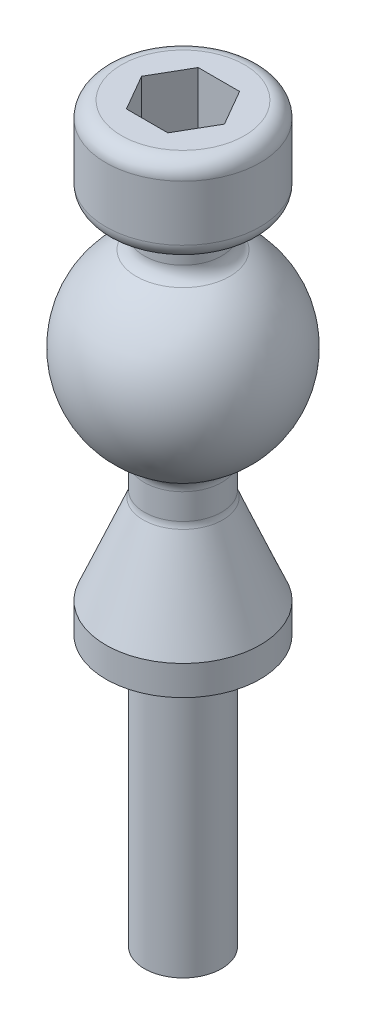
ISO-10303-21;
HEADER;
FILE_DESCRIPTION(('STEP AP214'),'2;1');
FILE_NAME('part.step','',(''),(''),'','','');
FILE_SCHEMA(('AUTOMOTIVE_DESIGN { 1 0 10303 214 1 1 1 1 }'));
ENDSEC;
DATA;
#1=APPLICATION_CONTEXT('core data for automotive mechanical design processes');
#2=APPLICATION_PROTOCOL_DEFINITION('international standard','automotive_design',2000,#1);
#3=PRODUCT_CONTEXT('',#1,'mechanical');
#4=PRODUCT('Part','Part','',(#3));
#5=PRODUCT_RELATED_PRODUCT_CATEGORY('part','',(#4));
#6=PRODUCT_DEFINITION_FORMATION('','',#4);
#7=PRODUCT_DEFINITION_CONTEXT('part definition',#1,'design');
#8=PRODUCT_DEFINITION('design','',#6,#7);
#9=PRODUCT_DEFINITION_SHAPE('','',#8);
#10=(LENGTH_UNIT() NAMED_UNIT(*) SI_UNIT(.MILLI.,.METRE.));
#11=(NAMED_UNIT(*) PLANE_ANGLE_UNIT() SI_UNIT($,.RADIAN.));
#12=(NAMED_UNIT(*) SI_UNIT($,.STERADIAN.) SOLID_ANGLE_UNIT());
#13=UNCERTAINTY_MEASURE_WITH_UNIT(LENGTH_MEASURE(1.E-05),#10,'distance_accuracy_value','');
#14=(GEOMETRIC_REPRESENTATION_CONTEXT(3) GLOBAL_UNCERTAINTY_ASSIGNED_CONTEXT((#13)) GLOBAL_UNIT_ASSIGNED_CONTEXT((#10,
#11,#12)) REPRESENTATION_CONTEXT('',''));
#15=CARTESIAN_POINT('',(0.,0.,0.));
#16=DIRECTION('',(0.,0.,1.));
#17=DIRECTION('',(1.,0.,0.));
#18=AXIS2_PLACEMENT_3D('',#15,#16,#17);
#19=CARTESIAN_POINT('',(0.,15.24,0.));
#20=DIRECTION('',(0.,-1.,0.));
#21=DIRECTION('',(1.,0.,0.));
#22=AXIS2_PLACEMENT_3D('',#19,#20,#21);
#23=PLANE('',#22);
#24=DIRECTION('',(0.5,0.,0.866025403784438));
#25=VECTOR('',#24,1.);
#26=CARTESIAN_POINT('',(-1.36381680587974,15.24,0.));
#27=LINE('',#26,#25);
#28=CARTESIAN_POINT('',(-1.36381680587974,15.24,0.));
#29=VERTEX_POINT('',#28);
#30=CARTESIAN_POINT('',(-0.681908402939869,15.24,1.1811));
#31=VERTEX_POINT('',#30);
#32=EDGE_CURVE('E121',#29,#31,#27,.T.);
#33=ORIENTED_EDGE('',*,*,#32,.F.);
#34=DIRECTION('',(-0.5,0.,0.866025403784439));
#35=VECTOR('',#34,1.);
#36=CARTESIAN_POINT('',(-0.681908402939869,15.24,-1.1811));
#37=LINE('',#36,#35);
#38=CARTESIAN_POINT('',(-0.681908402939869,15.24,-1.1811));
#39=VERTEX_POINT('',#38);
#40=EDGE_CURVE('E47',#39,#29,#37,.T.);
#41=ORIENTED_EDGE('',*,*,#40,.F.);
#42=DIRECTION('',(-1.,0.,0.));
#43=VECTOR('',#42,1.);
#44=CARTESIAN_POINT('',(0.681908402939864,15.24,-1.1811));
#45=LINE('',#44,#43);
#46=CARTESIAN_POINT('',(0.681908402939864,15.24,-1.1811));
#47=VERTEX_POINT('',#46);
#48=EDGE_CURVE('E130',#47,#39,#45,.T.);
#49=ORIENTED_EDGE('',*,*,#48,.F.);
#50=DIRECTION('',(-0.5,0.,-0.866025403784439));
#51=VECTOR('',#50,1.);
#52=CARTESIAN_POINT('',(1.36381680587973,15.24,0.));
#53=LINE('',#52,#51);
#54=CARTESIAN_POINT('',(1.36381680587973,15.24,0.));
#55=VERTEX_POINT('',#54);
#56=EDGE_CURVE('E128',#55,#47,#53,.T.);
#57=ORIENTED_EDGE('',*,*,#56,.F.);
#58=DIRECTION('',(0.5,0.,-0.866025403784439));
#59=VECTOR('',#58,1.);
#60=CARTESIAN_POINT('',(0.681908402939865,15.24,1.1811));
#61=LINE('',#60,#59);
#62=CARTESIAN_POINT('',(0.681908402939865,15.24,1.1811));
#63=VERTEX_POINT('',#62);
#64=EDGE_CURVE('E95',#63,#55,#61,.T.);
#65=ORIENTED_EDGE('',*,*,#64,.F.);
#66=DIRECTION('',(1.,0.,0.));
#67=VECTOR('',#66,1.);
#68=CARTESIAN_POINT('',(-0.681908402939869,15.24,1.1811));
#69=LINE('',#68,#67);
#70=EDGE_CURVE('E124',#31,#63,#69,.T.);
#71=ORIENTED_EDGE('',*,*,#70,.F.);
#72=EDGE_LOOP('',(#33,#41,#49,#57,#65,#71));
#73=FACE_BOUND('',#72,.T.);
#74=CARTESIAN_POINT('',(0.,15.24,0.));
#75=DIRECTION('',(0.,1.,0.));
#76=DIRECTION('',(-1.,0.,0.));
#77=AXIS2_PLACEMENT_3D('',#74,#75,#76);
#78=CIRCLE('',#77,2.02450269481178);
#79=CARTESIAN_POINT('',(-2.02450269481178,15.24,0.));
#80=VERTEX_POINT('',#79);
#81=EDGE_CURVE('E11',#80,#80,#78,.T.);
#82=ORIENTED_EDGE('',*,*,#81,.T.);
#83=EDGE_LOOP('',(#82));
#84=FACE_BOUND('',#83,.T.);
#85=ADVANCED_FACE('F33',(#73,#84),#23,.F.);
#86=CARTESIAN_POINT('',(0.,14.7245026948118,0.));
#87=DIRECTION('',(0.,1.,0.));
#88=DIRECTION('',(-1.,0.,0.));
#89=AXIS2_PLACEMENT_3D('',#86,#87,#88);
#90=TOROIDAL_SURFACE('',#89,2.02450269481178,0.515497305188219);
#91=ORIENTED_EDGE('',*,*,#81,.F.);
#92=EDGE_LOOP('',(#91));
#93=FACE_BOUND('',#92,.T.);
#94=CARTESIAN_POINT('',(0.,14.7245026948118,0.));
#95=DIRECTION('',(0.,1.,0.));
#96=DIRECTION('',(-1.,0.,0.));
#97=AXIS2_PLACEMENT_3D('',#94,#95,#96);
#98=CIRCLE('',#97,2.54);
#99=CARTESIAN_POINT('',(-2.54,14.7245026948118,0.));
#100=VERTEX_POINT('',#99);
#101=EDGE_CURVE('E40',#100,#100,#98,.T.);
#102=ORIENTED_EDGE('',*,*,#101,.T.);
#103=EDGE_LOOP('',(#102));
#104=FACE_BOUND('',#103,.T.);
#105=ADVANCED_FACE('F183',(#93,#104),#90,.T.);
#106=CARTESIAN_POINT('',(0.,15.24,0.));
#107=DIRECTION('',(0.,1.,0.));
#108=DIRECTION('',(-1.,0.,0.));
#109=AXIS2_PLACEMENT_3D('',#106,#107,#108);
#110=CYLINDRICAL_SURFACE('',#109,2.54);
#111=ORIENTED_EDGE('',*,*,#101,.F.);
#112=EDGE_LOOP('',(#111));
#113=FACE_BOUND('',#112,.T.);
#114=CARTESIAN_POINT('',(0.,12.8979973051882,0.));
#115=DIRECTION('',(0.,1.,0.));
#116=DIRECTION('',(-1.,0.,0.));
#117=AXIS2_PLACEMENT_3D('',#114,#115,#116);
#118=CIRCLE('',#117,2.54);
#119=CARTESIAN_POINT('',(-2.54,12.8979973051882,0.));
#120=VERTEX_POINT('',#119);
#121=EDGE_CURVE('E178',#120,#120,#118,.T.);
#122=ORIENTED_EDGE('',*,*,#121,.T.);
#123=EDGE_LOOP('',(#122));
#124=FACE_BOUND('',#123,.T.);
#125=ADVANCED_FACE('F185',(#113,#124),#110,.T.);
#126=CARTESIAN_POINT('',(0.,12.8979973051882,0.));
#127=DIRECTION('',(0.,1.,0.));
#128=DIRECTION('',(-1.,0.,0.));
#129=AXIS2_PLACEMENT_3D('',#126,#127,#128);
#130=TOROIDAL_SURFACE('',#129,2.02450269481178,0.515497305188219);
#131=ORIENTED_EDGE('',*,*,#121,.F.);
#132=EDGE_LOOP('',(#131));
#133=FACE_BOUND('',#132,.T.);
#134=CARTESIAN_POINT('',(0.,12.3825,0.));
#135=DIRECTION('',(0.,1.,0.));
#136=DIRECTION('',(-1.,0.,0.));
#137=AXIS2_PLACEMENT_3D('',#134,#135,#136);
#138=CIRCLE('',#137,2.02450269481178);
#139=CARTESIAN_POINT('',(-2.02450269481178,12.3825,0.));
#140=VERTEX_POINT('',#139);
#141=EDGE_CURVE('E175',#140,#140,#138,.T.);
#142=ORIENTED_EDGE('',*,*,#141,.T.);
#143=EDGE_LOOP('',(#142));
#144=FACE_BOUND('',#143,.T.);
#145=ADVANCED_FACE('F188',(#133,#144),#130,.T.);
#146=CARTESIAN_POINT('',(2.02450269481178,12.3825,0.));
#147=DIRECTION('',(0.,1.,0.));
#148=DIRECTION('',(-1.,0.,0.));
#149=AXIS2_PLACEMENT_3D('',#146,#147,#148);
#150=PLANE('',#149);
#151=ORIENTED_EDGE('',*,*,#141,.F.);
#152=EDGE_LOOP('',(#151));
#153=FACE_BOUND('',#152,.T.);
#154=CARTESIAN_POINT('',(0.,12.3825,0.));
#155=DIRECTION('',(0.,1.,0.));
#156=DIRECTION('',(-1.,0.,0.));
#157=AXIS2_PLACEMENT_3D('',#154,#155,#156);
#158=CIRCLE('',#157,1.78549730518822);
#159=CARTESIAN_POINT('',(-1.78549730518822,12.3825,0.));
#160=VERTEX_POINT('',#159);
#161=EDGE_CURVE('E172',#160,#160,#158,.T.);
#162=ORIENTED_EDGE('',*,*,#161,.T.);
#163=EDGE_LOOP('',(#162));
#164=FACE_BOUND('',#163,.T.);
#165=ADVANCED_FACE('F194',(#153,#164),#150,.F.);
#166=CARTESIAN_POINT('',(0.,11.8670026948118,0.));
#167=DIRECTION('',(0.,1.,0.));
#168=DIRECTION('',(-1.,0.,0.));
#169=AXIS2_PLACEMENT_3D('',#166,#167,#168);
#170=TOROIDAL_SURFACE('',#169,1.78549730518822,0.515497305188219);
#171=ORIENTED_EDGE('',*,*,#161,.F.);
#172=EDGE_LOOP('',(#171));
#173=FACE_BOUND('',#172,.T.);
#174=CARTESIAN_POINT('',(0.,11.8670026948118,0.));
#175=DIRECTION('',(0.,1.,0.));
#176=DIRECTION('',(-1.,0.,0.));
#177=AXIS2_PLACEMENT_3D('',#174,#175,#176);
#178=CIRCLE('',#177,1.27);
#179=CARTESIAN_POINT('',(-1.27,11.8670026948118,0.));
#180=VERTEX_POINT('',#179);
#181=EDGE_CURVE('E169',#180,#180,#178,.T.);
#182=ORIENTED_EDGE('',*,*,#181,.T.);
#183=EDGE_LOOP('',(#182));
#184=FACE_BOUND('',#183,.T.);
#185=ADVANCED_FACE('F200',(#173,#184),#170,.F.);
#186=CARTESIAN_POINT('',(0.,15.24,0.));
#187=DIRECTION('',(0.,1.,0.));
#188=DIRECTION('',(-1.,0.,0.));
#189=AXIS2_PLACEMENT_3D('',#186,#187,#188);
#190=CYLINDRICAL_SURFACE('',#189,1.27);
#191=ORIENTED_EDGE('',*,*,#181,.F.);
#192=EDGE_LOOP('',(#191));
#193=FACE_BOUND('',#192,.T.);
#194=CARTESIAN_POINT('',(0.,11.4323894649961,0.));
#195=DIRECTION('',(0.,1.,0.));
#196=DIRECTION('',(-1.,0.,0.));
#197=AXIS2_PLACEMENT_3D('',#194,#195,#196);
#198=CIRCLE('',#197,1.27);
#199=CARTESIAN_POINT('',(-1.27,11.4323894649961,0.));
#200=VERTEX_POINT('',#199);
#201=EDGE_CURVE('E166',#200,#200,#198,.T.);
#202=ORIENTED_EDGE('',*,*,#201,.T.);
#203=EDGE_LOOP('',(#202));
#204=FACE_BOUND('',#203,.T.);
#205=ADVANCED_FACE('F206',(#193,#204),#190,.T.);
#206=CARTESIAN_POINT('',(0.,11.4323894649961,0.));
#207=DIRECTION('',(0.,1.,0.));
#208=DIRECTION('',(-1.,0.,0.));
#209=AXIS2_PLACEMENT_3D('',#206,#207,#208);
#210=TOROIDAL_SURFACE('',#209,1.78549730518822,0.515497305188219);
#211=ORIENTED_EDGE('',*,*,#201,.F.);
#212=EDGE_LOOP('',(#211));
#213=FACE_BOUND('',#212,.T.);
#214=CARTESIAN_POINT('',(0.,10.9812399417271,0.));
#215=DIRECTION('',(0.,1.,0.));
#216=DIRECTION('',(-1.,0.,0.));
#217=AXIS2_PLACEMENT_3D('',#214,#215,#216);
#218=CIRCLE('',#217,1.5360948607124);
#219=CARTESIAN_POINT('',(1.5360948607124,10.9812399417271,0.));
#220=VERTEX_POINT('',#219);
#221=EDGE_CURVE('E163',#220,#220,#218,.T.);
#222=ORIENTED_EDGE('',*,*,#221,.T.);
#223=EDGE_LOOP('',(#222));
#224=FACE_BOUND('',#223,.T.);
#225=ADVANCED_FACE('F212',(#213,#224),#210,.F.);
#226=CARTESIAN_POINT('',(0.,8.20256443370304,0.));
#227=DIRECTION('',(0.,1.,0.));
#228=DIRECTION('',(1.,0.,0.));
#229=AXIS2_PLACEMENT_3D('',#226,#227,#228);
#230=SPHERICAL_SURFACE('',#229,3.175);
#231=CARTESIAN_POINT('',(0.,5.42388892567895,0.));
#232=DIRECTION('',(0.,1.,0.));
#233=DIRECTION('',(-1.,0.,0.));
#234=AXIS2_PLACEMENT_3D('',#231,#232,#233);
#235=CIRCLE('',#234,1.5360948607124);
#236=CARTESIAN_POINT('',(1.53609486071241,5.42388892567895,0.));
#237=VERTEX_POINT('',#236);
#238=EDGE_CURVE('E160',#237,#237,#235,.T.);
#239=CARTESIAN_POINT('',(1.5360948607124,10.9812399417271,0.));
#240=CARTESIAN_POINT('',(1.59779470955868,10.9471355752234,0.));
#241=CARTESIAN_POINT('',(1.65835464528086,10.910970086578,0.));
#242=CARTESIAN_POINT('',(1.77693495861089,10.8346910892589,0.));
#243=CARTESIAN_POINT('',(1.83495533621874,10.7945775805853,0.));
#244=CARTESIAN_POINT('',(1.94819680145398,10.7105767674652,0.));
#245=CARTESIAN_POINT('',(2.00341788908138,10.6666894630188,0.));
#246=CARTESIAN_POINT('',(2.1108164770995,10.5753367136276,0.));
#247=CARTESIAN_POINT('',(2.16299397749022,10.5278712686829,0.));
#248=CARTESIAN_POINT('',(2.2640737849774,10.4295725072636,0.));
#249=CARTESIAN_POINT('',(2.31297609207386,10.3787391907891,0.));
#250=CARTESIAN_POINT('',(2.40728865085206,10.2739302304776,0.));
#251=CARTESIAN_POINT('',(2.4526989025338,10.2199545866408,0.));
#252=CARTESIAN_POINT('',(2.53982591943265,10.1091003634086,0.));
#253=CARTESIAN_POINT('',(2.58154268464975,10.0522217840132,0.));
#254=CARTESIAN_POINT('',(2.66109769571783,9.93581398172825,0.));
#255=CARTESIAN_POINT('',(2.69893594156881,9.8762847588387,0.));
#256=CARTESIAN_POINT('',(2.77056608014429,9.75483971217198,0.));
#257=CARTESIAN_POINT('',(2.8043579728688,9.69292388839482,0.));
#258=CARTESIAN_POINT('',(2.86774552029059,9.56698027014875,0.));
#259=CARTESIAN_POINT('',(2.89734117498788,9.50295247567983,0.));
#260=CARTESIAN_POINT('',(2.95220497371757,9.37306891350159,0.));
#261=CARTESIAN_POINT('',(2.97747311774996,9.30721314579227,0.));
#262=CARTESIAN_POINT('',(3.02356981741918,9.17396574274927,0.));
#263=CARTESIAN_POINT('',(3.044398373056,9.10657410741559,0.));
#264=CARTESIAN_POINT('',(3.08152351013343,8.97055388710177,0.));
#265=CARTESIAN_POINT('',(3.09782009157404,8.90192530212163,0.));
#266=CARTESIAN_POINT('',(3.1258089961962,8.76373558703567,0.));
#267=CARTESIAN_POINT('',(3.13750131937775,8.69417445692986,0.));
#268=CARTESIAN_POINT('',(3.15622984576796,8.55442819244788,0.));
#269=CARTESIAN_POINT('',(3.16326604897662,8.48424305807172,0.));
#270=CARTESIAN_POINT('',(3.17265112609264,8.34356009369805,0.));
#271=CARTESIAN_POINT('',(3.175,8.27306226370055,0.));
#272=CARTESIAN_POINT('',(3.175,8.13206660370554,0.));
#273=CARTESIAN_POINT('',(3.17265112609264,8.06156877370803,0.));
#274=CARTESIAN_POINT('',(3.16326604897662,7.92088580933436,0.));
#275=CARTESIAN_POINT('',(3.15622984576796,7.8507006749582,0.));
#276=CARTESIAN_POINT('',(3.13750131937775,7.71095441047623,0.));
#277=CARTESIAN_POINT('',(3.1258089961962,7.64139328037041,0.));
#278=CARTESIAN_POINT('',(3.09782009157404,7.50320356528445,0.));
#279=CARTESIAN_POINT('',(3.08152351013343,7.43457498030431,0.));
#280=CARTESIAN_POINT('',(3.044398373056,7.29855475999049,0.));
#281=CARTESIAN_POINT('',(3.02356981741918,7.23116312465682,0.));
#282=CARTESIAN_POINT('',(2.97747311774996,7.09791572161382,0.));
#283=CARTESIAN_POINT('',(2.95220497371757,7.03205995390449,0.));
#284=CARTESIAN_POINT('',(2.89734117498788,6.90217639172625,0.));
#285=CARTESIAN_POINT('',(2.86774552029059,6.83814859725734,0.));
#286=CARTESIAN_POINT('',(2.8043579728688,6.71220497901126,0.));
#287=CARTESIAN_POINT('',(2.7705660801443,6.6502891552341,0.));
#288=CARTESIAN_POINT('',(2.69893594156881,6.52884410856738,0.));
#289=CARTESIAN_POINT('',(2.66109769571783,6.46931488567783,0.));
#290=CARTESIAN_POINT('',(2.58154268464975,6.35290708339287,0.));
#291=CARTESIAN_POINT('',(2.53982591943265,6.29602850399747,0.));
#292=CARTESIAN_POINT('',(2.4526989025338,6.18517428076525,0.));
#293=CARTESIAN_POINT('',(2.40728865085206,6.13119863692843,0.));
#294=CARTESIAN_POINT('',(2.31297609207386,6.02638967661703,0.));
#295=CARTESIAN_POINT('',(2.2640737849774,5.97555636014245,0.));
#296=CARTESIAN_POINT('',(2.16299397749022,5.87725759872316,0.));
#297=CARTESIAN_POINT('',(2.1108164770995,5.82979215377845,0.));
#298=CARTESIAN_POINT('',(2.00341788908138,5.73843940438731,0.));
#299=CARTESIAN_POINT('',(1.94819680145399,5.69455209994087,0.));
#300=CARTESIAN_POINT('',(1.83495533621874,5.6105512868208,0.));
#301=CARTESIAN_POINT('',(1.77693495861089,5.57043777814718,0.));
#302=CARTESIAN_POINT('',(1.65835464528087,5.4941587808281,0.));
#303=CARTESIAN_POINT('',(1.59779470955869,5.45799329218265,0.));
#304=CARTESIAN_POINT('',(1.53609486071241,5.42388892567895,0.));
#305=B_SPLINE_CURVE_WITH_KNOTS('',3,(#239,#240,#241,#242,#243,#244,#245,#246,#247,#248,#249,
#250,#251,#252,#253,#254,#255,#256,#257,#258,#259,#260,#261,#262,#263,#264,#265,#266,#267,#268,
#269,#270,#271,#272,#273,#274,#275,#276,#277,#278,#279,#280,#281,#282,#283,#284,#285,#286,#287,
#288,#289,#290,#291,#292,#293,#294,#295,#296,#297,#298,#299,#300,#301,#302,#303,#304),
.UNSPECIFIED.,.F.,.F.,(4,2,2,2,2,2,2,2,2,2,2,2,2,2,2,2,2,2,2,2,2,2,2,2,2,2,2,2,2,2,2,2,4),(0.,
0.211454413893626,0.42290882778725,0.634363241680874,0.8458176555745,1.05727206946813,
1.26872648336175,1.48018089725537,1.691635311149,1.90308972504262,2.11454413893625,
2.32599855282987,2.5374529667235,2.74890738061712,2.96036179451075,3.17181620840437,
3.383270622298,3.59472503619162,3.80617945008525,4.01763386397887,4.2290882778725,
4.44054269176612,4.65199710565975,4.86345151955337,5.074905933447,5.28636034734062,
5.49781476123425,5.70926917512787,5.9207235890215,6.13217800291512,6.34363241680875,
6.55508683070237,6.766541244596),.UNSPECIFIED.);
#306=EDGE_CURVE('BSEAM218',#220,#237,#305,.T.);
#307=ORIENTED_EDGE('',*,*,#221,.F.);
#308=ORIENTED_EDGE('',*,*,#238,.T.);
#309=ORIENTED_EDGE('',*,*,#306,.T.);
#310=ORIENTED_EDGE('',*,*,#306,.F.);
#311=EDGE_LOOP('',(#307,#309,#308,#310));
#312=FACE_BOUND('',#311,.T.);
#313=ADVANCED_FACE('F218',(#312),#230,.T.);
#314=CARTESIAN_POINT('',(0.,4.97273940241,0.));
#315=DIRECTION('',(0.,1.,0.));
#316=DIRECTION('',(-1.,0.,0.));
#317=AXIS2_PLACEMENT_3D('',#314,#315,#316);
#318=TOROIDAL_SURFACE('',#317,1.78549730518822,0.515497305188219);
#319=ORIENTED_EDGE('',*,*,#238,.F.);
#320=EDGE_LOOP('',(#319));
#321=FACE_BOUND('',#320,.T.);
#322=CARTESIAN_POINT('',(0.,4.97273940241,0.));
#323=DIRECTION('',(0.,1.,0.));
#324=DIRECTION('',(-1.,0.,0.));
#325=AXIS2_PLACEMENT_3D('',#322,#323,#324);
#326=CIRCLE('',#325,1.27);
#327=CARTESIAN_POINT('',(-1.27,4.97273940241,0.));
#328=VERTEX_POINT('',#327);
#329=EDGE_CURVE('E157',#328,#328,#326,.T.);
#330=ORIENTED_EDGE('',*,*,#329,.T.);
#331=EDGE_LOOP('',(#330));
#332=FACE_BOUND('',#331,.T.);
#333=ADVANCED_FACE('F224',(#321,#332),#318,.F.);
#334=CARTESIAN_POINT('',(0.,15.24,0.));
#335=DIRECTION('',(0.,1.,0.));
#336=DIRECTION('',(-1.,0.,0.));
#337=AXIS2_PLACEMENT_3D('',#334,#335,#336);
#338=CYLINDRICAL_SURFACE('',#337,1.27);
#339=ORIENTED_EDGE('',*,*,#329,.F.);
#340=EDGE_LOOP('',(#339));
#341=FACE_BOUND('',#340,.T.);
#342=CARTESIAN_POINT('',(0.,4.12572832844373,0.));
#343=DIRECTION('',(0.,1.,0.));
#344=DIRECTION('',(-1.,0.,0.));
#345=AXIS2_PLACEMENT_3D('',#342,#343,#344);
#346=CIRCLE('',#345,1.27);
#347=CARTESIAN_POINT('',(-1.27,4.12572832844373,0.));
#348=VERTEX_POINT('',#347);
#349=EDGE_CURVE('E154',#348,#348,#346,.T.);
#350=ORIENTED_EDGE('',*,*,#349,.T.);
#351=EDGE_LOOP('',(#350));
#352=FACE_BOUND('',#351,.T.);
#353=ADVANCED_FACE('F230',(#341,#352),#338,.T.);
#354=CARTESIAN_POINT('',(0.,4.12572832844373,0.));
#355=DIRECTION('',(0.,1.,0.));
#356=DIRECTION('',(-1.,0.,0.));
#357=AXIS2_PLACEMENT_3D('',#354,#355,#356);
#358=TOROIDAL_SURFACE('',#357,1.78549730518822,0.515497305188219);
#359=ORIENTED_EDGE('',*,*,#349,.F.);
#360=EDGE_LOOP('',(#359));
#361=FACE_BOUND('',#360,.T.);
#362=CARTESIAN_POINT('',(0.,3.92746013414056,0.));
#363=DIRECTION('',(0.,1.,0.));
#364=DIRECTION('',(-1.,0.,0.));
#365=AXIS2_PLACEMENT_3D('',#362,#363,#364);
#366=CIRCLE('',#365,1.30965363886063);
#367=CARTESIAN_POINT('',(-1.30965363886063,3.92746013414056,0.));
#368=VERTEX_POINT('',#367);
#369=EDGE_CURVE('E151',#368,#368,#366,.T.);
#370=ORIENTED_EDGE('',*,*,#369,.T.);
#371=EDGE_LOOP('',(#370));
#372=FACE_BOUND('',#371,.T.);
#373=ADVANCED_FACE('F236',(#361,#372),#358,.F.);
#374=CARTESIAN_POINT('',(0.,0.974628867406081,0.));
#375=DIRECTION('',(0.,-1.,0.));
#376=DIRECTION('',(1.,0.,0.));
#377=AXIS2_PLACEMENT_3D('',#374,#375,#376);
#378=CONICAL_SURFACE('',#377,2.54,0.394791119699761);
#379=ORIENTED_EDGE('',*,*,#369,.F.);
#380=EDGE_LOOP('',(#379));
#381=FACE_BOUND('',#380,.T.);
#382=CARTESIAN_POINT('',(0.,0.974628867406081,0.));
#383=DIRECTION('',(0.,1.,0.));
#384=DIRECTION('',(-1.,0.,0.));
#385=AXIS2_PLACEMENT_3D('',#382,#383,#384);
#386=CIRCLE('',#385,2.54);
#387=CARTESIAN_POINT('',(-2.54,0.974628867406081,0.));
#388=VERTEX_POINT('',#387);
#389=EDGE_CURVE('E148',#388,#388,#386,.T.);
#390=ORIENTED_EDGE('',*,*,#389,.T.);
#391=EDGE_LOOP('',(#390));
#392=FACE_BOUND('',#391,.T.);
#393=ADVANCED_FACE('F242',(#381,#392),#378,.T.);
#394=CARTESIAN_POINT('',(0.,15.24,0.));
#395=DIRECTION('',(0.,1.,0.));
#396=DIRECTION('',(-1.,0.,0.));
#397=AXIS2_PLACEMENT_3D('',#394,#395,#396);
#398=CYLINDRICAL_SURFACE('',#397,2.54);
#399=ORIENTED_EDGE('',*,*,#389,.F.);
#400=EDGE_LOOP('',(#399));
#401=FACE_BOUND('',#400,.T.);
#402=CARTESIAN_POINT('',(0.,0.,0.));
#403=DIRECTION('',(0.,1.,0.));
#404=DIRECTION('',(-1.,0.,0.));
#405=AXIS2_PLACEMENT_3D('',#402,#403,#404);
#406=CIRCLE('',#405,2.54);
#407=CARTESIAN_POINT('',(-2.54,0.,0.));
#408=VERTEX_POINT('',#407);
#409=EDGE_CURVE('E145',#408,#408,#406,.T.);
#410=ORIENTED_EDGE('',*,*,#409,.T.);
#411=EDGE_LOOP('',(#410));
#412=FACE_BOUND('',#411,.T.);
#413=ADVANCED_FACE('F248',(#401,#412),#398,.T.);
#414=CARTESIAN_POINT('',(2.54,0.,0.));
#415=DIRECTION('',(0.,1.,0.));
#416=DIRECTION('',(-1.,0.,0.));
#417=AXIS2_PLACEMENT_3D('',#414,#415,#416);
#418=PLANE('',#417);
#419=ORIENTED_EDGE('',*,*,#409,.F.);
#420=EDGE_LOOP('',(#419));
#421=FACE_BOUND('',#420,.T.);
#422=CARTESIAN_POINT('',(0.,0.,0.));
#423=DIRECTION('',(0.,1.,0.));
#424=DIRECTION('',(-1.,0.,0.));
#425=AXIS2_PLACEMENT_3D('',#422,#423,#424);
#426=CIRCLE('',#425,1.27);
#427=CARTESIAN_POINT('',(-1.27,0.,0.));
#428=VERTEX_POINT('',#427);
#429=EDGE_CURVE('E142',#428,#428,#426,.T.);
#430=ORIENTED_EDGE('',*,*,#429,.T.);
#431=EDGE_LOOP('',(#430));
#432=FACE_BOUND('',#431,.T.);
#433=ADVANCED_FACE('F254',(#421,#432),#418,.F.);
#434=CARTESIAN_POINT('',(0.,15.24,0.));
#435=DIRECTION('',(0.,1.,0.));
#436=DIRECTION('',(-1.,0.,0.));
#437=AXIS2_PLACEMENT_3D('',#434,#435,#436);
#438=CYLINDRICAL_SURFACE('',#437,1.27);
#439=ORIENTED_EDGE('',*,*,#429,.F.);
#440=EDGE_LOOP('',(#439));
#441=FACE_BOUND('',#440,.T.);
#442=CARTESIAN_POINT('',(0.,-8.89,0.));
#443=DIRECTION('',(0.,1.,0.));
#444=DIRECTION('',(-1.,0.,0.));
#445=AXIS2_PLACEMENT_3D('',#442,#443,#444);
#446=CIRCLE('',#445,1.27);
#447=CARTESIAN_POINT('',(-1.27,-8.89,0.));
#448=VERTEX_POINT('',#447);
#449=EDGE_CURVE('E134',#448,#448,#446,.T.);
#450=ORIENTED_EDGE('',*,*,#449,.T.);
#451=EDGE_LOOP('',(#450));
#452=FACE_BOUND('',#451,.T.);
#453=ADVANCED_FACE('F260',(#441,#452),#438,.T.);
#454=CARTESIAN_POINT('',(0.,-8.89,0.));
#455=DIRECTION('',(0.,1.,0.));
#456=DIRECTION('',(-1.,0.,0.));
#457=AXIS2_PLACEMENT_3D('',#454,#455,#456);
#458=PLANE('',#457);
#459=ORIENTED_EDGE('',*,*,#449,.F.);
#460=EDGE_LOOP('',(#459));
#461=FACE_BOUND('',#460,.T.);
#462=ADVANCED_FACE('F266',(#461),#458,.F.);
#463=CARTESIAN_POINT('',(-0.681908402939869,12.7,-1.1811));
#464=DIRECTION('',(-0.866025403784439,0.,-0.499999999999999));
#465=DIRECTION('',(-0.5,0.,0.866025403784439));
#466=AXIS2_PLACEMENT_3D('',#463,#464,#465);
#467=PLANE('',#466);
#468=ORIENTED_EDGE('',*,*,#40,.T.);
#469=DIRECTION('',(0.,1.,0.));
#470=VECTOR('',#469,1.);
#471=CARTESIAN_POINT('',(-1.36381680587974,12.7,0.));
#472=LINE('',#471,#470);
#473=CARTESIAN_POINT('',(-1.36381680587974,12.7,0.));
#474=VERTEX_POINT('',#473);
#475=EDGE_CURVE('E77',#474,#29,#472,.T.);
#476=ORIENTED_EDGE('',*,*,#475,.F.);
#477=DIRECTION('',(-0.5,0.,0.866025403784439));
#478=VECTOR('',#477,1.);
#479=CARTESIAN_POINT('',(-0.681908402939869,12.7,-1.1811));
#480=LINE('',#479,#478);
#481=CARTESIAN_POINT('',(-0.681908402939869,12.7,-1.1811));
#482=VERTEX_POINT('',#481);
#483=EDGE_CURVE('E132',#482,#474,#480,.T.);
#484=ORIENTED_EDGE('',*,*,#483,.F.);
#485=DIRECTION('',(0.,1.,0.));
#486=VECTOR('',#485,1.);
#487=CARTESIAN_POINT('',(-0.681908402939869,12.7,-1.1811));
#488=LINE('',#487,#486);
#489=EDGE_CURVE('E55',#482,#39,#488,.T.);
#490=ORIENTED_EDGE('',*,*,#489,.T.);
#491=EDGE_LOOP('',(#468,#476,#484,#490));
#492=FACE_BOUND('',#491,.T.);
#493=ADVANCED_FACE('F271',(#492),#467,.F.);
#494=CARTESIAN_POINT('',(0.681908402939865,12.7,-1.1811));
#495=DIRECTION('',(0.,0.,-1.));
#496=DIRECTION('',(-1.,0.,0.));
#497=AXIS2_PLACEMENT_3D('',#494,#495,#496);
#498=PLANE('',#497);
#499=ORIENTED_EDGE('',*,*,#48,.T.);
#500=ORIENTED_EDGE('',*,*,#489,.F.);
#501=DIRECTION('',(-1.,0.,0.));
#502=VECTOR('',#501,1.);
#503=CARTESIAN_POINT('',(0.681908402939865,12.7,-1.1811));
#504=LINE('',#503,#502);
#505=CARTESIAN_POINT('',(0.681908402939865,12.7,-1.1811));
#506=VERTEX_POINT('',#505);
#507=EDGE_CURVE('E107',#506,#482,#504,.T.);
#508=ORIENTED_EDGE('',*,*,#507,.F.);
#509=DIRECTION('',(0.,1.,0.));
#510=VECTOR('',#509,1.);
#511=CARTESIAN_POINT('',(0.681908402939865,12.7,-1.1811));
#512=LINE('',#511,#510);
#513=EDGE_CURVE('E99',#506,#47,#512,.T.);
#514=ORIENTED_EDGE('',*,*,#513,.T.);
#515=EDGE_LOOP('',(#499,#500,#508,#514));
#516=FACE_BOUND('',#515,.T.);
#517=ADVANCED_FACE('F276',(#516),#498,.F.);
#518=CARTESIAN_POINT('',(1.36381680587973,12.7,0.));
#519=DIRECTION('',(0.866025403784438,0.,-0.5));
#520=DIRECTION('',(-0.5,0.,-0.866025403784439));
#521=AXIS2_PLACEMENT_3D('',#518,#519,#520);
#522=PLANE('',#521);
#523=ORIENTED_EDGE('',*,*,#56,.T.);
#524=ORIENTED_EDGE('',*,*,#513,.F.);
#525=DIRECTION('',(-0.5,0.,-0.866025403784439));
#526=VECTOR('',#525,1.);
#527=CARTESIAN_POINT('',(1.36381680587973,12.7,0.));
#528=LINE('',#527,#526);
#529=CARTESIAN_POINT('',(1.36381680587973,12.7,0.));
#530=VERTEX_POINT('',#529);
#531=EDGE_CURVE('E103',#530,#506,#528,.T.);
#532=ORIENTED_EDGE('',*,*,#531,.F.);
#533=DIRECTION('',(0.,1.,0.));
#534=VECTOR('',#533,1.);
#535=CARTESIAN_POINT('',(1.36381680587973,12.7,0.));
#536=LINE('',#535,#534);
#537=EDGE_CURVE('E88',#530,#55,#536,.T.);
#538=ORIENTED_EDGE('',*,*,#537,.T.);
#539=EDGE_LOOP('',(#523,#524,#532,#538));
#540=FACE_BOUND('',#539,.T.);
#541=ADVANCED_FACE('F104',(#540),#522,.F.);
#542=CARTESIAN_POINT('',(0.681908402939865,12.7,1.1811));
#543=DIRECTION('',(0.866025403784439,0.,0.5));
#544=DIRECTION('',(0.5,0.,-0.866025403784439));
#545=AXIS2_PLACEMENT_3D('',#542,#543,#544);
#546=PLANE('',#545);
#547=ORIENTED_EDGE('',*,*,#64,.T.);
#548=ORIENTED_EDGE('',*,*,#537,.F.);
#549=DIRECTION('',(0.5,0.,-0.866025403784439));
#550=VECTOR('',#549,1.);
#551=CARTESIAN_POINT('',(0.681908402939865,12.7,1.1811));
#552=LINE('',#551,#550);
#553=CARTESIAN_POINT('',(0.681908402939865,12.7,1.1811));
#554=VERTEX_POINT('',#553);
#555=EDGE_CURVE('E92',#554,#530,#552,.T.);
#556=ORIENTED_EDGE('',*,*,#555,.F.);
#557=DIRECTION('',(0.,1.,0.));
#558=VECTOR('',#557,1.);
#559=CARTESIAN_POINT('',(0.681908402939865,12.7,1.1811));
#560=LINE('',#559,#558);
#561=EDGE_CURVE('E100',#554,#63,#560,.T.);
#562=ORIENTED_EDGE('',*,*,#561,.T.);
#563=EDGE_LOOP('',(#547,#548,#556,#562));
#564=FACE_BOUND('',#563,.T.);
#565=ADVANCED_FACE('F90',(#564),#546,.F.);
#566=CARTESIAN_POINT('',(-0.681908402939868,12.7,1.1811));
#567=DIRECTION('',(0.,0.,1.));
#568=DIRECTION('',(1.,0.,0.));
#569=AXIS2_PLACEMENT_3D('',#566,#567,#568);
#570=PLANE('',#569);
#571=ORIENTED_EDGE('',*,*,#70,.T.);
#572=ORIENTED_EDGE('',*,*,#561,.F.);
#573=DIRECTION('',(1.,0.,0.));
#574=VECTOR('',#573,1.);
#575=CARTESIAN_POINT('',(-0.681908402939868,12.7,1.1811));
#576=LINE('',#575,#574);
#577=CARTESIAN_POINT('',(-0.681908402939868,12.7,1.1811));
#578=VERTEX_POINT('',#577);
#579=EDGE_CURVE('E113',#578,#554,#576,.T.);
#580=ORIENTED_EDGE('',*,*,#579,.F.);
#581=DIRECTION('',(0.,1.,0.));
#582=VECTOR('',#581,1.);
#583=CARTESIAN_POINT('',(-0.681908402939868,12.7,1.1811));
#584=LINE('',#583,#582);
#585=EDGE_CURVE('E137',#578,#31,#584,.T.);
#586=ORIENTED_EDGE('',*,*,#585,.T.);
#587=EDGE_LOOP('',(#571,#572,#580,#586));
#588=FACE_BOUND('',#587,.T.);
#589=ADVANCED_FACE('F302',(#588),#570,.F.);
#590=CARTESIAN_POINT('',(-1.36381680587974,12.7,0.));
#591=DIRECTION('',(-0.866025403784438,0.,0.5));
#592=DIRECTION('',(0.5,0.,0.866025403784438));
#593=AXIS2_PLACEMENT_3D('',#590,#591,#592);
#594=PLANE('',#593);
#595=ORIENTED_EDGE('',*,*,#32,.T.);
#596=ORIENTED_EDGE('',*,*,#585,.F.);
#597=DIRECTION('',(0.5,0.,0.866025403784438));
#598=VECTOR('',#597,1.);
#599=CARTESIAN_POINT('',(-1.36381680587974,12.7,0.));
#600=LINE('',#599,#598);
#601=EDGE_CURVE('E115',#474,#578,#600,.T.);
#602=ORIENTED_EDGE('',*,*,#601,.F.);
#603=ORIENTED_EDGE('',*,*,#475,.T.);
#604=EDGE_LOOP('',(#595,#596,#602,#603));
#605=FACE_BOUND('',#604,.T.);
#606=ADVANCED_FACE('F290',(#605),#594,.F.);
#607=CARTESIAN_POINT('',(0.,12.7,0.));
#608=DIRECTION('',(0.,1.,0.));
#609=DIRECTION('',(0.,0.,1.));
#610=AXIS2_PLACEMENT_3D('',#607,#608,#609);
#611=PLANE('',#610);
#612=ORIENTED_EDGE('',*,*,#483,.T.);
#613=ORIENTED_EDGE('',*,*,#601,.T.);
#614=ORIENTED_EDGE('',*,*,#579,.T.);
#615=ORIENTED_EDGE('',*,*,#555,.T.);
#616=ORIENTED_EDGE('',*,*,#531,.T.);
#617=ORIENTED_EDGE('',*,*,#507,.T.);
#618=EDGE_LOOP('',(#612,#613,#614,#615,#616,#617));
#619=FACE_BOUND('',#618,.T.);
#620=ADVANCED_FACE('F110',(#619),#611,.T.);
#621=CLOSED_SHELL('',(#85,#105,#125,#145,#165,#185,#205,#225,#313,#333,#353,#373,#393,#413,#433,
#453,#462,#493,#517,#541,#565,#589,#606,#620));
#622=MANIFOLD_SOLID_BREP('B2',#621);
#623=ADVANCED_BREP_SHAPE_REPRESENTATION('',(#18,#622),#14);
#624=SHAPE_DEFINITION_REPRESENTATION(#9,#623);
ENDSEC;
END-ISO-10303-21;
